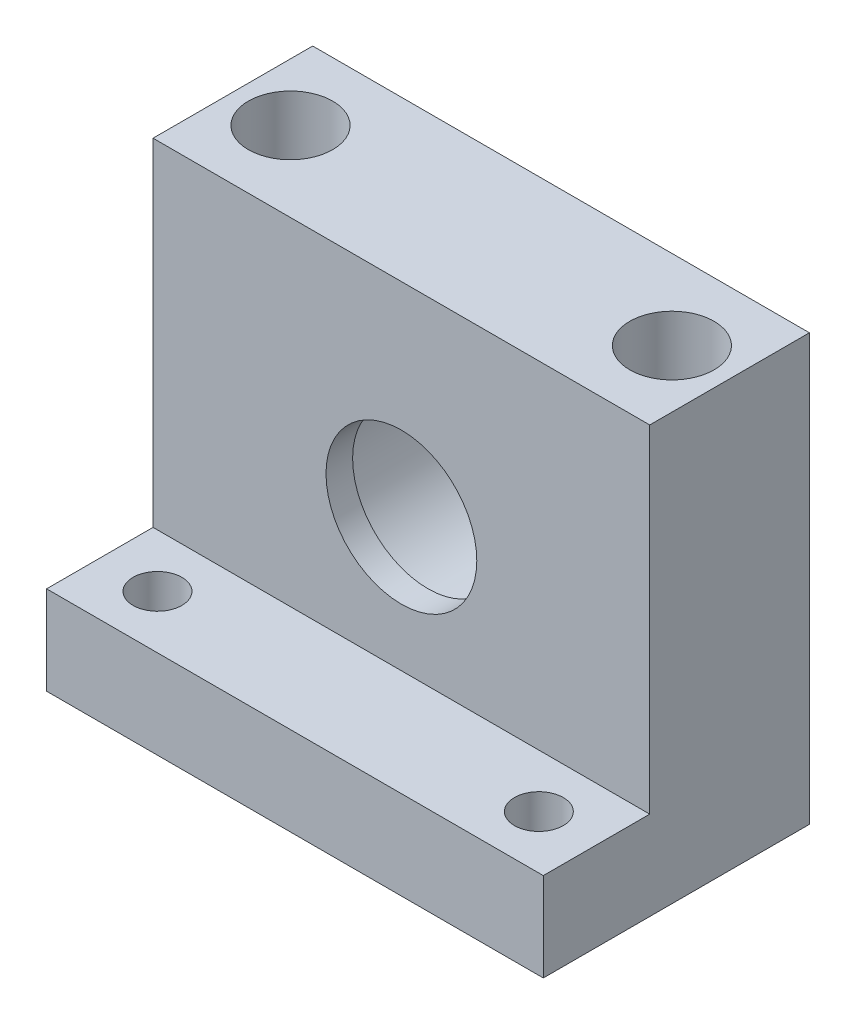
ISO-10303-21;
HEADER;
FILE_DESCRIPTION(('STEP AP214'),'2;1');
FILE_NAME('part.step','',(''),(''),'','','');
FILE_SCHEMA(('AUTOMOTIVE_DESIGN { 1 0 10303 214 1 1 1 1 }'));
ENDSEC;
DATA;
#1=APPLICATION_CONTEXT('core data for automotive mechanical design processes');
#2=APPLICATION_PROTOCOL_DEFINITION('international standard','automotive_design',2000,#1);
#3=PRODUCT_CONTEXT('',#1,'mechanical');
#4=PRODUCT('Part','Part','',(#3));
#5=PRODUCT_RELATED_PRODUCT_CATEGORY('part','',(#4));
#6=PRODUCT_DEFINITION_FORMATION('','',#4);
#7=PRODUCT_DEFINITION_CONTEXT('part definition',#1,'design');
#8=PRODUCT_DEFINITION('design','',#6,#7);
#9=PRODUCT_DEFINITION_SHAPE('','',#8);
#10=(LENGTH_UNIT() NAMED_UNIT(*) SI_UNIT(.MILLI.,.METRE.));
#11=(NAMED_UNIT(*) PLANE_ANGLE_UNIT() SI_UNIT($,.RADIAN.));
#12=(NAMED_UNIT(*) SI_UNIT($,.STERADIAN.) SOLID_ANGLE_UNIT());
#13=UNCERTAINTY_MEASURE_WITH_UNIT(LENGTH_MEASURE(1.E-05),#10,'distance_accuracy_value','');
#14=(GEOMETRIC_REPRESENTATION_CONTEXT(3) GLOBAL_UNCERTAINTY_ASSIGNED_CONTEXT((#13)) GLOBAL_UNIT_ASSIGNED_CONTEXT((#10,
#11,#12)) REPRESENTATION_CONTEXT('',''));
#15=CARTESIAN_POINT('',(0.,0.,0.));
#16=DIRECTION('',(0.,0.,1.));
#17=DIRECTION('',(1.,0.,0.));
#18=AXIS2_PLACEMENT_3D('',#15,#16,#17);
#19=CARTESIAN_POINT('',(28.,24.,18.));
#20=DIRECTION('',(-1.,0.,0.));
#21=DIRECTION('',(0.,-1.,0.));
#22=AXIS2_PLACEMENT_3D('',#19,#20,#21);
#23=PLANE('',#22);
#24=DIRECTION('',(0.,1.,0.));
#25=VECTOR('',#24,1.);
#26=CARTESIAN_POINT('',(28.,24.,0.));
#27=LINE('',#26,#25);
#28=CARTESIAN_POINT('',(28.,-24.,0.));
#29=VERTEX_POINT('',#28);
#30=CARTESIAN_POINT('',(28.,24.,0.));
#31=VERTEX_POINT('',#30);
#32=EDGE_CURVE('E99',#29,#31,#27,.T.);
#33=ORIENTED_EDGE('',*,*,#32,.T.);
#34=DIRECTION('',(0.,0.,-1.));
#35=VECTOR('',#34,1.);
#36=CARTESIAN_POINT('',(28.,24.,18.));
#37=LINE('',#36,#35);
#38=CARTESIAN_POINT('',(28.,24.,18.));
#39=VERTEX_POINT('',#38);
#40=EDGE_CURVE('E11',#39,#31,#37,.T.);
#41=ORIENTED_EDGE('',*,*,#40,.F.);
#42=DIRECTION('',(0.,1.,0.));
#43=VECTOR('',#42,1.);
#44=CARTESIAN_POINT('',(28.,24.,18.));
#45=LINE('',#44,#43);
#46=CARTESIAN_POINT('',(28.,-14.,18.));
#47=VERTEX_POINT('',#46);
#48=EDGE_CURVE('E92',#47,#39,#45,.T.);
#49=ORIENTED_EDGE('',*,*,#48,.F.);
#50=DIRECTION('',(0.,0.,-1.));
#51=VECTOR('',#50,1.);
#52=CARTESIAN_POINT('',(28.,-14.,30.));
#53=LINE('',#52,#51);
#54=CARTESIAN_POINT('',(28.,-14.,30.));
#55=VERTEX_POINT('',#54);
#56=EDGE_CURVE('E142',#55,#47,#53,.T.);
#57=ORIENTED_EDGE('',*,*,#56,.F.);
#58=DIRECTION('',(0.,1.,0.));
#59=VECTOR('',#58,1.);
#60=CARTESIAN_POINT('',(28.,-24.,30.));
#61=LINE('',#60,#59);
#62=CARTESIAN_POINT('',(28.,-24.,30.));
#63=VERTEX_POINT('',#62);
#64=EDGE_CURVE('E102',#63,#55,#61,.T.);
#65=ORIENTED_EDGE('',*,*,#64,.F.);
#66=DIRECTION('',(0.,0.,-1.));
#67=VECTOR('',#66,1.);
#68=CARTESIAN_POINT('',(28.,-24.,18.));
#69=LINE('',#68,#67);
#70=EDGE_CURVE('E85',#63,#29,#69,.T.);
#71=ORIENTED_EDGE('',*,*,#70,.T.);
#72=EDGE_LOOP('',(#33,#41,#49,#57,#65,#71));
#73=FACE_BOUND('',#72,.T.);
#74=ADVANCED_FACE('F38',(#73),#23,.F.);
#75=CARTESIAN_POINT('',(-28.,24.,18.));
#76=DIRECTION('',(0.,-1.,0.));
#77=DIRECTION('',(0.,0.,-1.));
#78=AXIS2_PLACEMENT_3D('',#75,#76,#77);
#79=PLANE('',#78);
#80=CARTESIAN_POINT('',(-21.5,24.,9.));
#81=DIRECTION('',(0.,1.,0.));
#82=DIRECTION('',(0.,0.,1.));
#83=AXIS2_PLACEMENT_3D('',#80,#81,#82);
#84=CIRCLE('',#83,4.75);
#85=CARTESIAN_POINT('',(-21.5,24.,13.75));
#86=VERTEX_POINT('',#85);
#87=EDGE_CURVE('E149',#86,#86,#84,.T.);
#88=ORIENTED_EDGE('',*,*,#87,.F.);
#89=EDGE_LOOP('',(#88));
#90=FACE_BOUND('',#89,.T.);
#91=CARTESIAN_POINT('',(21.5,24.,9.));
#92=DIRECTION('',(0.,1.,0.));
#93=DIRECTION('',(0.,0.,1.));
#94=AXIS2_PLACEMENT_3D('',#91,#92,#93);
#95=CIRCLE('',#94,4.75);
#96=CARTESIAN_POINT('',(21.5,24.,13.75));
#97=VERTEX_POINT('',#96);
#98=EDGE_CURVE('E169',#97,#97,#95,.T.);
#99=ORIENTED_EDGE('',*,*,#98,.F.);
#100=EDGE_LOOP('',(#99));
#101=FACE_BOUND('',#100,.T.);
#102=DIRECTION('',(-1.,0.,0.));
#103=VECTOR('',#102,1.);
#104=CARTESIAN_POINT('',(-28.,24.,0.));
#105=LINE('',#104,#103);
#106=CARTESIAN_POINT('',(-28.,24.,0.));
#107=VERTEX_POINT('',#106);
#108=EDGE_CURVE('E106',#31,#107,#105,.T.);
#109=ORIENTED_EDGE('',*,*,#108,.T.);
#110=DIRECTION('',(0.,0.,-1.));
#111=VECTOR('',#110,1.);
#112=CARTESIAN_POINT('',(-28.,24.,18.));
#113=LINE('',#112,#111);
#114=CARTESIAN_POINT('',(-28.,24.,18.));
#115=VERTEX_POINT('',#114);
#116=EDGE_CURVE('E46',#115,#107,#113,.T.);
#117=ORIENTED_EDGE('',*,*,#116,.F.);
#118=DIRECTION('',(-1.,0.,0.));
#119=VECTOR('',#118,1.);
#120=CARTESIAN_POINT('',(-28.,24.,18.));
#121=LINE('',#120,#119);
#122=EDGE_CURVE('E60',#39,#115,#121,.T.);
#123=ORIENTED_EDGE('',*,*,#122,.F.);
#124=ORIENTED_EDGE('',*,*,#40,.T.);
#125=EDGE_LOOP('',(#109,#117,#123,#124));
#126=FACE_BOUND('',#125,.T.);
#127=ADVANCED_FACE('F232',(#90,#101,#126),#79,.F.);
#128=CARTESIAN_POINT('',(-28.,24.,18.));
#129=DIRECTION('',(1.,0.,0.));
#130=DIRECTION('',(0.,1.,0.));
#131=AXIS2_PLACEMENT_3D('',#128,#129,#130);
#132=PLANE('',#131);
#133=DIRECTION('',(0.,-1.,0.));
#134=VECTOR('',#133,1.);
#135=CARTESIAN_POINT('',(-28.,24.,0.));
#136=LINE('',#135,#134);
#137=CARTESIAN_POINT('',(-28.,-24.,0.));
#138=VERTEX_POINT('',#137);
#139=EDGE_CURVE('E93',#107,#138,#136,.T.);
#140=ORIENTED_EDGE('',*,*,#139,.T.);
#141=DIRECTION('',(0.,0.,-1.));
#142=VECTOR('',#141,1.);
#143=CARTESIAN_POINT('',(-28.,-24.,18.));
#144=LINE('',#143,#142);
#145=CARTESIAN_POINT('',(-28.,-24.,30.));
#146=VERTEX_POINT('',#145);
#147=EDGE_CURVE('E88',#146,#138,#144,.T.);
#148=ORIENTED_EDGE('',*,*,#147,.F.);
#149=DIRECTION('',(0.,-1.,0.));
#150=VECTOR('',#149,1.);
#151=CARTESIAN_POINT('',(-28.,-24.,30.));
#152=LINE('',#151,#150);
#153=CARTESIAN_POINT('',(-28.,-14.,30.));
#154=VERTEX_POINT('',#153);
#155=EDGE_CURVE('E143',#154,#146,#152,.T.);
#156=ORIENTED_EDGE('',*,*,#155,.F.);
#157=DIRECTION('',(0.,0.,-1.));
#158=VECTOR('',#157,1.);
#159=CARTESIAN_POINT('',(-28.,-14.,30.));
#160=LINE('',#159,#158);
#161=CARTESIAN_POINT('',(-28.,-14.,18.));
#162=VERTEX_POINT('',#161);
#163=EDGE_CURVE('E140',#154,#162,#160,.T.);
#164=ORIENTED_EDGE('',*,*,#163,.T.);
#165=DIRECTION('',(0.,-1.,0.));
#166=VECTOR('',#165,1.);
#167=CARTESIAN_POINT('',(-28.,24.,18.));
#168=LINE('',#167,#166);
#169=EDGE_CURVE('E103',#115,#162,#168,.T.);
#170=ORIENTED_EDGE('',*,*,#169,.F.);
#171=ORIENTED_EDGE('',*,*,#116,.T.);
#172=EDGE_LOOP('',(#140,#148,#156,#164,#170,#171));
#173=FACE_BOUND('',#172,.T.);
#174=ADVANCED_FACE('F145',(#173),#132,.F.);
#175=CARTESIAN_POINT('',(-28.,-24.,18.));
#176=DIRECTION('',(0.,1.,0.));
#177=DIRECTION('',(0.,0.,1.));
#178=AXIS2_PLACEMENT_3D('',#175,#176,#177);
#179=PLANE('',#178);
#180=CARTESIAN_POINT('',(-21.5,-24.,24.));
#181=DIRECTION('',(0.,1.,0.));
#182=DIRECTION('',(0.,0.,1.));
#183=AXIS2_PLACEMENT_3D('',#180,#181,#182);
#184=CIRCLE('',#183,2.74999999999999);
#185=CARTESIAN_POINT('',(-21.5,-24.,26.75));
#186=VERTEX_POINT('',#185);
#187=EDGE_CURVE('E250',#186,#186,#184,.T.);
#188=ORIENTED_EDGE('',*,*,#187,.T.);
#189=EDGE_LOOP('',(#188));
#190=FACE_BOUND('',#189,.T.);
#191=CARTESIAN_POINT('',(21.5,-24.,24.));
#192=DIRECTION('',(0.,1.,0.));
#193=DIRECTION('',(0.,0.,1.));
#194=AXIS2_PLACEMENT_3D('',#191,#192,#193);
#195=CIRCLE('',#194,2.74999999999999);
#196=CARTESIAN_POINT('',(21.5,-24.,26.75));
#197=VERTEX_POINT('',#196);
#198=EDGE_CURVE('E144',#197,#197,#195,.T.);
#199=ORIENTED_EDGE('',*,*,#198,.T.);
#200=EDGE_LOOP('',(#199));
#201=FACE_BOUND('',#200,.T.);
#202=CARTESIAN_POINT('',(-21.5,-24.,9.));
#203=DIRECTION('',(0.,1.,0.));
#204=DIRECTION('',(0.,0.,1.));
#205=AXIS2_PLACEMENT_3D('',#202,#203,#204);
#206=CIRCLE('',#205,2.74999999999999);
#207=CARTESIAN_POINT('',(-21.5,-24.,11.75));
#208=VERTEX_POINT('',#207);
#209=EDGE_CURVE('E166',#208,#208,#206,.T.);
#210=ORIENTED_EDGE('',*,*,#209,.T.);
#211=EDGE_LOOP('',(#210));
#212=FACE_BOUND('',#211,.T.);
#213=CARTESIAN_POINT('',(21.5,-24.,9.));
#214=DIRECTION('',(0.,1.,0.));
#215=DIRECTION('',(0.,0.,1.));
#216=AXIS2_PLACEMENT_3D('',#213,#214,#215);
#217=CIRCLE('',#216,2.74999999999999);
#218=CARTESIAN_POINT('',(21.5,-24.,11.75));
#219=VERTEX_POINT('',#218);
#220=EDGE_CURVE('E178',#219,#219,#217,.T.);
#221=ORIENTED_EDGE('',*,*,#220,.T.);
#222=EDGE_LOOP('',(#221));
#223=FACE_BOUND('',#222,.T.);
#224=DIRECTION('',(1.,0.,0.));
#225=VECTOR('',#224,1.);
#226=CARTESIAN_POINT('',(-28.,-24.,0.));
#227=LINE('',#226,#225);
#228=EDGE_CURVE('E80',#138,#29,#227,.T.);
#229=ORIENTED_EDGE('',*,*,#228,.T.);
#230=ORIENTED_EDGE('',*,*,#70,.F.);
#231=DIRECTION('',(1.,0.,0.));
#232=VECTOR('',#231,1.);
#233=CARTESIAN_POINT('',(-28.,-24.,30.));
#234=LINE('',#233,#232);
#235=EDGE_CURVE('E279',#146,#63,#234,.T.);
#236=ORIENTED_EDGE('',*,*,#235,.F.);
#237=ORIENTED_EDGE('',*,*,#147,.T.);
#238=EDGE_LOOP('',(#229,#230,#236,#237));
#239=FACE_BOUND('',#238,.T.);
#240=ADVANCED_FACE('F82',(#190,#201,#212,#223,#239),#179,.F.);
#241=CARTESIAN_POINT('',(0.,0.,18.));
#242=DIRECTION('',(0.,0.,1.));
#243=DIRECTION('',(1.,0.,0.));
#244=AXIS2_PLACEMENT_3D('',#241,#242,#243);
#245=PLANE('',#244);
#246=DIRECTION('',(-1.,0.,0.));
#247=VECTOR('',#246,1.);
#248=CARTESIAN_POINT('',(-28.,-14.,18.));
#249=LINE('',#248,#247);
#250=EDGE_CURVE('E54',#47,#162,#249,.T.);
#251=ORIENTED_EDGE('',*,*,#250,.F.);
#252=ORIENTED_EDGE('',*,*,#48,.T.);
#253=ORIENTED_EDGE('',*,*,#122,.T.);
#254=ORIENTED_EDGE('',*,*,#169,.T.);
#255=EDGE_LOOP('',(#251,#252,#253,#254));
#256=FACE_BOUND('',#255,.T.);
#257=CARTESIAN_POINT('',(0.,1.,18.));
#258=DIRECTION('',(0.,0.,1.));
#259=DIRECTION('',(1.,0.,0.));
#260=AXIS2_PLACEMENT_3D('',#257,#258,#259);
#261=CIRCLE('',#260,8.5);
#262=CARTESIAN_POINT('',(8.5,1.,18.));
#263=VERTEX_POINT('',#262);
#264=EDGE_CURVE('E208',#263,#263,#261,.T.);
#265=ORIENTED_EDGE('',*,*,#264,.F.);
#266=EDGE_LOOP('',(#265));
#267=FACE_BOUND('',#266,.T.);
#268=ADVANCED_FACE('F128',(#256,#267),#245,.T.);
#269=CARTESIAN_POINT('',(0.,0.,0.));
#270=DIRECTION('',(0.,0.,1.));
#271=DIRECTION('',(1.,0.,0.));
#272=AXIS2_PLACEMENT_3D('',#269,#270,#271);
#273=PLANE('',#272);
#274=CARTESIAN_POINT('',(-12.5,19.,0.));
#275=DIRECTION('',(0.,0.,-1.));
#276=DIRECTION('',(-1.,0.,0.));
#277=AXIS2_PLACEMENT_3D('',#274,#275,#276);
#278=CIRCLE('',#277,3.);
#279=CARTESIAN_POINT('',(-15.5,19.,0.));
#280=VERTEX_POINT('',#279);
#281=EDGE_CURVE('E574',#280,#280,#278,.T.);
#282=ORIENTED_EDGE('',*,*,#281,.F.);
#283=EDGE_LOOP('',(#282));
#284=FACE_BOUND('',#283,.T.);
#285=CARTESIAN_POINT('',(12.5,19.,0.));
#286=DIRECTION('',(0.,0.,-1.));
#287=DIRECTION('',(-1.,0.,0.));
#288=AXIS2_PLACEMENT_3D('',#285,#286,#287);
#289=CIRCLE('',#288,3.);
#290=CARTESIAN_POINT('',(9.5,19.,0.));
#291=VERTEX_POINT('',#290);
#292=EDGE_CURVE('E573',#291,#291,#289,.T.);
#293=ORIENTED_EDGE('',*,*,#292,.F.);
#294=EDGE_LOOP('',(#293));
#295=FACE_BOUND('',#294,.T.);
#296=CARTESIAN_POINT('',(-12.,8.00000000000001,0.));
#297=DIRECTION('',(0.,0.,-1.));
#298=DIRECTION('',(-1.,0.,0.));
#299=AXIS2_PLACEMENT_3D('',#296,#297,#298);
#300=CIRCLE('',#299,1.25);
#301=CARTESIAN_POINT('',(-13.25,8.00000000000001,0.));
#302=VERTEX_POINT('',#301);
#303=EDGE_CURVE('E181',#302,#302,#300,.T.);
#304=ORIENTED_EDGE('',*,*,#303,.F.);
#305=EDGE_LOOP('',(#304));
#306=FACE_BOUND('',#305,.T.);
#307=CARTESIAN_POINT('',(12.,8.00000000000001,0.));
#308=DIRECTION('',(0.,0.,-1.));
#309=DIRECTION('',(-1.,0.,0.));
#310=AXIS2_PLACEMENT_3D('',#307,#308,#309);
#311=CIRCLE('',#310,1.25);
#312=CARTESIAN_POINT('',(10.75,8.00000000000001,0.));
#313=VERTEX_POINT('',#312);
#314=EDGE_CURVE('E187',#313,#313,#311,.T.);
#315=ORIENTED_EDGE('',*,*,#314,.F.);
#316=EDGE_LOOP('',(#315));
#317=FACE_BOUND('',#316,.T.);
#318=CARTESIAN_POINT('',(-12.,-6.,0.));
#319=DIRECTION('',(0.,0.,-1.));
#320=DIRECTION('',(-1.,0.,0.));
#321=AXIS2_PLACEMENT_3D('',#318,#319,#320);
#322=CIRCLE('',#321,1.25);
#323=CARTESIAN_POINT('',(-13.25,-6.,0.));
#324=VERTEX_POINT('',#323);
#325=EDGE_CURVE('E193',#324,#324,#322,.T.);
#326=ORIENTED_EDGE('',*,*,#325,.F.);
#327=EDGE_LOOP('',(#326));
#328=FACE_BOUND('',#327,.T.);
#329=CARTESIAN_POINT('',(12.,-6.,0.));
#330=DIRECTION('',(0.,0.,-1.));
#331=DIRECTION('',(-1.,0.,0.));
#332=AXIS2_PLACEMENT_3D('',#329,#330,#331);
#333=CIRCLE('',#332,1.25);
#334=CARTESIAN_POINT('',(10.75,-6.,0.));
#335=VERTEX_POINT('',#334);
#336=EDGE_CURVE('E199',#335,#335,#333,.T.);
#337=ORIENTED_EDGE('',*,*,#336,.F.);
#338=EDGE_LOOP('',(#337));
#339=FACE_BOUND('',#338,.T.);
#340=CARTESIAN_POINT('',(0.,1.,0.));
#341=DIRECTION('',(0.,0.,-1.));
#342=DIRECTION('',(-1.,0.,0.));
#343=AXIS2_PLACEMENT_3D('',#340,#341,#342);
#344=CIRCLE('',#343,11.);
#345=CARTESIAN_POINT('',(-11.,1.,0.));
#346=VERTEX_POINT('',#345);
#347=EDGE_CURVE('E111',#346,#346,#344,.T.);
#348=ORIENTED_EDGE('',*,*,#347,.F.);
#349=EDGE_LOOP('',(#348));
#350=FACE_BOUND('',#349,.T.);
#351=ORIENTED_EDGE('',*,*,#32,.F.);
#352=ORIENTED_EDGE('',*,*,#228,.F.);
#353=ORIENTED_EDGE('',*,*,#139,.F.);
#354=ORIENTED_EDGE('',*,*,#108,.F.);
#355=EDGE_LOOP('',(#351,#352,#353,#354));
#356=FACE_BOUND('',#355,.T.);
#357=ADVANCED_FACE('F105',(#284,#295,#306,#317,#328,#339,#350,#356),#273,.F.);
#358=CARTESIAN_POINT('',(0.,1.,15.));
#359=DIRECTION('',(0.,0.,-1.));
#360=DIRECTION('',(-1.,0.,0.));
#361=AXIS2_PLACEMENT_3D('',#358,#359,#360);
#362=CYLINDRICAL_SURFACE('',#361,11.);
#363=CARTESIAN_POINT('',(0.,1.,15.));
#364=DIRECTION('',(0.,0.,-1.));
#365=DIRECTION('',(-1.,0.,0.));
#366=AXIS2_PLACEMENT_3D('',#363,#364,#365);
#367=CIRCLE('',#366,11.);
#368=CARTESIAN_POINT('',(-11.,1.,15.));
#369=VERTEX_POINT('',#368);
#370=EDGE_CURVE('E107',#369,#369,#367,.T.);
#371=ORIENTED_EDGE('',*,*,#370,.F.);
#372=EDGE_LOOP('',(#371));
#373=FACE_BOUND('',#372,.T.);
#374=ORIENTED_EDGE('',*,*,#347,.T.);
#375=EDGE_LOOP('',(#374));
#376=FACE_BOUND('',#375,.T.);
#377=ADVANCED_FACE('F215',(#373,#376),#362,.F.);
#378=CARTESIAN_POINT('',(0.,1.,15.));
#379=DIRECTION('',(0.,0.,-1.));
#380=DIRECTION('',(-1.,0.,0.));
#381=AXIS2_PLACEMENT_3D('',#378,#379,#380);
#382=PLANE('',#381);
#383=CARTESIAN_POINT('',(0.,1.,15.));
#384=DIRECTION('',(0.,0.,-1.));
#385=DIRECTION('',(-1.,0.,0.));
#386=AXIS2_PLACEMENT_3D('',#383,#384,#385);
#387=CIRCLE('',#386,8.5);
#388=CARTESIAN_POINT('',(-8.5,1.,15.));
#389=VERTEX_POINT('',#388);
#390=EDGE_CURVE('E205',#389,#389,#387,.T.);
#391=ORIENTED_EDGE('',*,*,#390,.F.);
#392=EDGE_LOOP('',(#391));
#393=FACE_BOUND('',#392,.T.);
#394=ORIENTED_EDGE('',*,*,#370,.T.);
#395=EDGE_LOOP('',(#394));
#396=FACE_BOUND('',#395,.T.);
#397=ADVANCED_FACE('F224',(#393,#396),#382,.T.);
#398=CARTESIAN_POINT('',(0.,1.,32.));
#399=DIRECTION('',(0.,0.,-1.));
#400=DIRECTION('',(-1.,0.,0.));
#401=AXIS2_PLACEMENT_3D('',#398,#399,#400);
#402=CYLINDRICAL_SURFACE('',#401,8.5);
#403=ORIENTED_EDGE('',*,*,#264,.T.);
#404=EDGE_LOOP('',(#403));
#405=FACE_BOUND('',#404,.T.);
#406=ORIENTED_EDGE('',*,*,#390,.T.);
#407=EDGE_LOOP('',(#406));
#408=FACE_BOUND('',#407,.T.);
#409=ADVANCED_FACE('F305',(#405,#408),#402,.F.);
#410=CARTESIAN_POINT('',(12.,-6.,8.5));
#411=DIRECTION('',(0.,0.,-1.));
#412=DIRECTION('',(-1.,0.,0.));
#413=AXIS2_PLACEMENT_3D('',#410,#411,#412);
#414=CONICAL_SURFACE('',#413,1.25,1.02974425867665);
#415=CARTESIAN_POINT('',(12.,-6.,9.25107577378445));
#416=VERTEX_POINT('',#415);
#417=VERTEX_LOOP('',#416);
#418=FACE_BOUND('',#417,.T.);
#419=CARTESIAN_POINT('',(12.,-6.,8.5));
#420=DIRECTION('',(0.,0.,-1.));
#421=DIRECTION('',(-1.,0.,0.));
#422=AXIS2_PLACEMENT_3D('',#419,#420,#421);
#423=CIRCLE('',#422,1.25);
#424=CARTESIAN_POINT('',(10.75,-6.,8.5));
#425=VERTEX_POINT('',#424);
#426=EDGE_CURVE('E202',#425,#425,#423,.T.);
#427=ORIENTED_EDGE('',*,*,#426,.T.);
#428=EDGE_LOOP('',(#427));
#429=FACE_BOUND('',#428,.T.);
#430=ADVANCED_FACE('F301',(#418,#429),#414,.F.);
#431=CARTESIAN_POINT('',(12.,-6.,0.));
#432=DIRECTION('',(0.,0.,-1.));
#433=DIRECTION('',(-1.,0.,0.));
#434=AXIS2_PLACEMENT_3D('',#431,#432,#433);
#435=CYLINDRICAL_SURFACE('',#434,1.25);
#436=ORIENTED_EDGE('',*,*,#426,.F.);
#437=EDGE_LOOP('',(#436));
#438=FACE_BOUND('',#437,.T.);
#439=ORIENTED_EDGE('',*,*,#336,.T.);
#440=EDGE_LOOP('',(#439));
#441=FACE_BOUND('',#440,.T.);
#442=ADVANCED_FACE('F304',(#438,#441),#435,.F.);
#443=CARTESIAN_POINT('',(-12.,-6.,8.5));
#444=DIRECTION('',(0.,0.,-1.));
#445=DIRECTION('',(-1.,0.,0.));
#446=AXIS2_PLACEMENT_3D('',#443,#444,#445);
#447=CONICAL_SURFACE('',#446,1.25,1.02974425867665);
#448=CARTESIAN_POINT('',(-12.,-6.,9.25107577378445));
#449=VERTEX_POINT('',#448);
#450=VERTEX_LOOP('',#449);
#451=FACE_BOUND('',#450,.T.);
#452=CARTESIAN_POINT('',(-12.,-6.,8.5));
#453=DIRECTION('',(0.,0.,-1.));
#454=DIRECTION('',(-1.,0.,0.));
#455=AXIS2_PLACEMENT_3D('',#452,#453,#454);
#456=CIRCLE('',#455,1.25);
#457=CARTESIAN_POINT('',(-13.25,-6.,8.5));
#458=VERTEX_POINT('',#457);
#459=EDGE_CURVE('E196',#458,#458,#456,.T.);
#460=ORIENTED_EDGE('',*,*,#459,.T.);
#461=EDGE_LOOP('',(#460));
#462=FACE_BOUND('',#461,.T.);
#463=ADVANCED_FACE('F311',(#451,#462),#447,.F.);
#464=CARTESIAN_POINT('',(-12.,-6.,0.));
#465=DIRECTION('',(0.,0.,-1.));
#466=DIRECTION('',(-1.,0.,0.));
#467=AXIS2_PLACEMENT_3D('',#464,#465,#466);
#468=CYLINDRICAL_SURFACE('',#467,1.25);
#469=ORIENTED_EDGE('',*,*,#459,.F.);
#470=EDGE_LOOP('',(#469));
#471=FACE_BOUND('',#470,.T.);
#472=ORIENTED_EDGE('',*,*,#325,.T.);
#473=EDGE_LOOP('',(#472));
#474=FACE_BOUND('',#473,.T.);
#475=ADVANCED_FACE('F318',(#471,#474),#468,.F.);
#476=CARTESIAN_POINT('',(12.,8.00000000000001,8.5));
#477=DIRECTION('',(0.,0.,-1.));
#478=DIRECTION('',(-1.,0.,0.));
#479=AXIS2_PLACEMENT_3D('',#476,#477,#478);
#480=CONICAL_SURFACE('',#479,1.25,1.02974425867665);
#481=CARTESIAN_POINT('',(12.,8.00000000000001,9.25107577378445));
#482=VERTEX_POINT('',#481);
#483=VERTEX_LOOP('',#482);
#484=FACE_BOUND('',#483,.T.);
#485=CARTESIAN_POINT('',(12.,8.00000000000001,8.5));
#486=DIRECTION('',(0.,0.,-1.));
#487=DIRECTION('',(-1.,0.,0.));
#488=AXIS2_PLACEMENT_3D('',#485,#486,#487);
#489=CIRCLE('',#488,1.25);
#490=CARTESIAN_POINT('',(10.75,8.00000000000001,8.5));
#491=VERTEX_POINT('',#490);
#492=EDGE_CURVE('E190',#491,#491,#489,.T.);
#493=ORIENTED_EDGE('',*,*,#492,.T.);
#494=EDGE_LOOP('',(#493));
#495=FACE_BOUND('',#494,.T.);
#496=ADVANCED_FACE('F367',(#484,#495),#480,.F.);
#497=CARTESIAN_POINT('',(12.,8.00000000000001,0.));
#498=DIRECTION('',(0.,0.,-1.));
#499=DIRECTION('',(-1.,0.,0.));
#500=AXIS2_PLACEMENT_3D('',#497,#498,#499);
#501=CYLINDRICAL_SURFACE('',#500,1.25);
#502=ORIENTED_EDGE('',*,*,#492,.F.);
#503=EDGE_LOOP('',(#502));
#504=FACE_BOUND('',#503,.T.);
#505=ORIENTED_EDGE('',*,*,#314,.T.);
#506=EDGE_LOOP('',(#505));
#507=FACE_BOUND('',#506,.T.);
#508=ADVANCED_FACE('F378',(#504,#507),#501,.F.);
#509=CARTESIAN_POINT('',(-12.,8.00000000000001,8.5));
#510=DIRECTION('',(0.,0.,-1.));
#511=DIRECTION('',(-1.,0.,0.));
#512=AXIS2_PLACEMENT_3D('',#509,#510,#511);
#513=CONICAL_SURFACE('',#512,1.25,1.02974425867665);
#514=CARTESIAN_POINT('',(-12.,8.00000000000001,9.25107577378445));
#515=VERTEX_POINT('',#514);
#516=VERTEX_LOOP('',#515);
#517=FACE_BOUND('',#516,.T.);
#518=CARTESIAN_POINT('',(-12.,8.00000000000001,8.5));
#519=DIRECTION('',(0.,0.,-1.));
#520=DIRECTION('',(-1.,0.,0.));
#521=AXIS2_PLACEMENT_3D('',#518,#519,#520);
#522=CIRCLE('',#521,1.25);
#523=CARTESIAN_POINT('',(-13.25,8.00000000000001,8.5));
#524=VERTEX_POINT('',#523);
#525=EDGE_CURVE('E184',#524,#524,#522,.T.);
#526=ORIENTED_EDGE('',*,*,#525,.T.);
#527=EDGE_LOOP('',(#526));
#528=FACE_BOUND('',#527,.T.);
#529=ADVANCED_FACE('F388',(#517,#528),#513,.F.);
#530=CARTESIAN_POINT('',(-12.,8.00000000000001,0.));
#531=DIRECTION('',(0.,0.,-1.));
#532=DIRECTION('',(-1.,0.,0.));
#533=AXIS2_PLACEMENT_3D('',#530,#531,#532);
#534=CYLINDRICAL_SURFACE('',#533,1.25);
#535=ORIENTED_EDGE('',*,*,#525,.F.);
#536=EDGE_LOOP('',(#535));
#537=FACE_BOUND('',#536,.T.);
#538=ORIENTED_EDGE('',*,*,#303,.T.);
#539=EDGE_LOOP('',(#538));
#540=FACE_BOUND('',#539,.T.);
#541=ADVANCED_FACE('F262',(#537,#540),#534,.F.);
#542=CARTESIAN_POINT('',(21.5,24.,9.));
#543=DIRECTION('',(0.,1.,0.));
#544=DIRECTION('',(0.,0.,1.));
#545=AXIS2_PLACEMENT_3D('',#542,#543,#544);
#546=CYLINDRICAL_SURFACE('',#545,2.74999999999999);
#547=ORIENTED_EDGE('',*,*,#220,.F.);
#548=EDGE_LOOP('',(#547));
#549=FACE_BOUND('',#548,.T.);
#550=CARTESIAN_POINT('',(21.5,-5.99999999999999,9.));
#551=DIRECTION('',(0.,1.,0.));
#552=DIRECTION('',(0.,0.,1.));
#553=AXIS2_PLACEMENT_3D('',#550,#551,#552);
#554=CIRCLE('',#553,2.75);
#555=CARTESIAN_POINT('',(21.5,-5.99999999999999,11.75));
#556=VERTEX_POINT('',#555);
#557=EDGE_CURVE('E175',#556,#556,#554,.T.);
#558=ORIENTED_EDGE('',*,*,#557,.T.);
#559=EDGE_LOOP('',(#558));
#560=FACE_BOUND('',#559,.T.);
#561=ADVANCED_FACE('F258',(#549,#560),#546,.F.);
#562=CARTESIAN_POINT('',(24.25,-5.99999999999999,9.));
#563=DIRECTION('',(0.,-1.,0.));
#564=DIRECTION('',(0.,0.,-1.));
#565=AXIS2_PLACEMENT_3D('',#562,#563,#564);
#566=PLANE('',#565);
#567=ORIENTED_EDGE('',*,*,#557,.F.);
#568=EDGE_LOOP('',(#567));
#569=FACE_BOUND('',#568,.T.);
#570=CARTESIAN_POINT('',(21.5,-5.99999999999999,9.));
#571=DIRECTION('',(0.,1.,0.));
#572=DIRECTION('',(0.,0.,1.));
#573=AXIS2_PLACEMENT_3D('',#570,#571,#572);
#574=CIRCLE('',#573,4.74999999999999);
#575=CARTESIAN_POINT('',(21.5,-5.99999999999999,13.75));
#576=VERTEX_POINT('',#575);
#577=EDGE_CURVE('E172',#576,#576,#574,.T.);
#578=ORIENTED_EDGE('',*,*,#577,.T.);
#579=EDGE_LOOP('',(#578));
#580=FACE_BOUND('',#579,.T.);
#581=ADVANCED_FACE('F261',(#569,#580),#566,.F.);
#582=CARTESIAN_POINT('',(21.5,24.,9.));
#583=DIRECTION('',(0.,1.,0.));
#584=DIRECTION('',(0.,0.,1.));
#585=AXIS2_PLACEMENT_3D('',#582,#583,#584);
#586=CYLINDRICAL_SURFACE('',#585,4.75);
#587=ORIENTED_EDGE('',*,*,#577,.F.);
#588=EDGE_LOOP('',(#587));
#589=FACE_BOUND('',#588,.T.);
#590=ORIENTED_EDGE('',*,*,#98,.T.);
#591=EDGE_LOOP('',(#590));
#592=FACE_BOUND('',#591,.T.);
#593=ADVANCED_FACE('F268',(#589,#592),#586,.F.);
#594=CARTESIAN_POINT('',(-21.5,24.,9.));
#595=DIRECTION('',(0.,1.,0.));
#596=DIRECTION('',(0.,0.,1.));
#597=AXIS2_PLACEMENT_3D('',#594,#595,#596);
#598=CYLINDRICAL_SURFACE('',#597,2.74999999999999);
#599=ORIENTED_EDGE('',*,*,#209,.F.);
#600=EDGE_LOOP('',(#599));
#601=FACE_BOUND('',#600,.T.);
#602=CARTESIAN_POINT('',(-21.5,-5.99999999999999,9.));
#603=DIRECTION('',(0.,1.,0.));
#604=DIRECTION('',(0.,0.,1.));
#605=AXIS2_PLACEMENT_3D('',#602,#603,#604);
#606=CIRCLE('',#605,2.75);
#607=CARTESIAN_POINT('',(-21.5,-5.99999999999999,11.75));
#608=VERTEX_POINT('',#607);
#609=EDGE_CURVE('E163',#608,#608,#606,.T.);
#610=ORIENTED_EDGE('',*,*,#609,.T.);
#611=EDGE_LOOP('',(#610));
#612=FACE_BOUND('',#611,.T.);
#613=ADVANCED_FACE('F274',(#601,#612),#598,.F.);
#614=CARTESIAN_POINT('',(-18.75,-5.99999999999999,9.));
#615=DIRECTION('',(0.,-1.,0.));
#616=DIRECTION('',(0.,0.,-1.));
#617=AXIS2_PLACEMENT_3D('',#614,#615,#616);
#618=PLANE('',#617);
#619=ORIENTED_EDGE('',*,*,#609,.F.);
#620=EDGE_LOOP('',(#619));
#621=FACE_BOUND('',#620,.T.);
#622=CARTESIAN_POINT('',(-21.5,-5.99999999999999,9.));
#623=DIRECTION('',(0.,1.,0.));
#624=DIRECTION('',(0.,0.,1.));
#625=AXIS2_PLACEMENT_3D('',#622,#623,#624);
#626=CIRCLE('',#625,4.74999999999999);
#627=CARTESIAN_POINT('',(-21.5,-5.99999999999999,13.75));
#628=VERTEX_POINT('',#627);
#629=EDGE_CURVE('E160',#628,#628,#626,.T.);
#630=ORIENTED_EDGE('',*,*,#629,.T.);
#631=EDGE_LOOP('',(#630));
#632=FACE_BOUND('',#631,.T.);
#633=ADVANCED_FACE('F443',(#621,#632),#618,.F.);
#634=CARTESIAN_POINT('',(-21.5,24.,9.));
#635=DIRECTION('',(0.,1.,0.));
#636=DIRECTION('',(0.,0.,1.));
#637=AXIS2_PLACEMENT_3D('',#634,#635,#636);
#638=CYLINDRICAL_SURFACE('',#637,4.75);
#639=ORIENTED_EDGE('',*,*,#629,.F.);
#640=EDGE_LOOP('',(#639));
#641=FACE_BOUND('',#640,.T.);
#642=ORIENTED_EDGE('',*,*,#87,.T.);
#643=EDGE_LOOP('',(#642));
#644=FACE_BOUND('',#643,.T.);
#645=ADVANCED_FACE('F453',(#641,#644),#638,.F.);
#646=CARTESIAN_POINT('',(-28.,-14.,30.));
#647=DIRECTION('',(0.,-1.,0.));
#648=DIRECTION('',(0.,0.,-1.));
#649=AXIS2_PLACEMENT_3D('',#646,#647,#648);
#650=PLANE('',#649);
#651=CARTESIAN_POINT('',(-21.5,-14.,24.));
#652=DIRECTION('',(0.,1.,0.));
#653=DIRECTION('',(0.,0.,1.));
#654=AXIS2_PLACEMENT_3D('',#651,#652,#653);
#655=CIRCLE('',#654,2.74999999999999);
#656=CARTESIAN_POINT('',(-21.5,-14.,26.75));
#657=VERTEX_POINT('',#656);
#658=EDGE_CURVE('E583',#657,#657,#655,.T.);
#659=ORIENTED_EDGE('',*,*,#658,.F.);
#660=EDGE_LOOP('',(#659));
#661=FACE_BOUND('',#660,.T.);
#662=CARTESIAN_POINT('',(21.5,-14.,24.));
#663=DIRECTION('',(0.,1.,0.));
#664=DIRECTION('',(0.,0.,1.));
#665=AXIS2_PLACEMENT_3D('',#662,#663,#664);
#666=CIRCLE('',#665,2.74999999999999);
#667=CARTESIAN_POINT('',(21.5,-14.,26.75));
#668=VERTEX_POINT('',#667);
#669=EDGE_CURVE('E587',#668,#668,#666,.T.);
#670=ORIENTED_EDGE('',*,*,#669,.F.);
#671=EDGE_LOOP('',(#670));
#672=FACE_BOUND('',#671,.T.);
#673=ORIENTED_EDGE('',*,*,#250,.T.);
#674=ORIENTED_EDGE('',*,*,#163,.F.);
#675=DIRECTION('',(-1.,0.,0.));
#676=VECTOR('',#675,1.);
#677=CARTESIAN_POINT('',(-28.,-14.,30.));
#678=LINE('',#677,#676);
#679=EDGE_CURVE('E147',#55,#154,#678,.T.);
#680=ORIENTED_EDGE('',*,*,#679,.F.);
#681=ORIENTED_EDGE('',*,*,#56,.T.);
#682=EDGE_LOOP('',(#673,#674,#680,#681));
#683=FACE_BOUND('',#682,.T.);
#684=ADVANCED_FACE('F137',(#661,#672,#683),#650,.F.);
#685=CARTESIAN_POINT('',(0.,0.,30.));
#686=DIRECTION('',(0.,0.,-1.));
#687=DIRECTION('',(-1.,0.,0.));
#688=AXIS2_PLACEMENT_3D('',#685,#686,#687);
#689=PLANE('',#688);
#690=ORIENTED_EDGE('',*,*,#155,.T.);
#691=ORIENTED_EDGE('',*,*,#235,.T.);
#692=ORIENTED_EDGE('',*,*,#64,.T.);
#693=ORIENTED_EDGE('',*,*,#679,.T.);
#694=EDGE_LOOP('',(#690,#691,#692,#693));
#695=FACE_BOUND('',#694,.T.);
#696=ADVANCED_FACE('F282',(#695),#689,.F.);
#697=CARTESIAN_POINT('',(21.5,-14.,24.));
#698=DIRECTION('',(0.,1.,0.));
#699=DIRECTION('',(0.,0.,1.));
#700=AXIS2_PLACEMENT_3D('',#697,#698,#699);
#701=CYLINDRICAL_SURFACE('',#700,2.74999999999999);
#702=ORIENTED_EDGE('',*,*,#198,.F.);
#703=EDGE_LOOP('',(#702));
#704=FACE_BOUND('',#703,.T.);
#705=ORIENTED_EDGE('',*,*,#669,.T.);
#706=EDGE_LOOP('',(#705));
#707=FACE_BOUND('',#706,.T.);
#708=ADVANCED_FACE('F491',(#704,#707),#701,.F.);
#709=CARTESIAN_POINT('',(-21.5,-14.,24.));
#710=DIRECTION('',(0.,1.,0.));
#711=DIRECTION('',(0.,0.,1.));
#712=AXIS2_PLACEMENT_3D('',#709,#710,#711);
#713=CYLINDRICAL_SURFACE('',#712,2.74999999999999);
#714=ORIENTED_EDGE('',*,*,#187,.F.);
#715=EDGE_LOOP('',(#714));
#716=FACE_BOUND('',#715,.T.);
#717=ORIENTED_EDGE('',*,*,#658,.T.);
#718=EDGE_LOOP('',(#717));
#719=FACE_BOUND('',#718,.T.);
#720=ADVANCED_FACE('F512',(#716,#719),#713,.F.);
#721=CARTESIAN_POINT('',(12.5,19.,8.));
#722=DIRECTION('',(0.,0.,-1.));
#723=DIRECTION('',(-1.,0.,0.));
#724=AXIS2_PLACEMENT_3D('',#721,#722,#723);
#725=CYLINDRICAL_SURFACE('',#724,3.);
#726=CARTESIAN_POINT('',(12.5,19.,8.));
#727=DIRECTION('',(0.,0.,-1.));
#728=DIRECTION('',(-1.,0.,0.));
#729=AXIS2_PLACEMENT_3D('',#726,#727,#728);
#730=CIRCLE('',#729,3.);
#731=CARTESIAN_POINT('',(9.5,19.,8.));
#732=VERTEX_POINT('',#731);
#733=EDGE_CURVE('E577',#732,#732,#730,.T.);
#734=ORIENTED_EDGE('',*,*,#733,.F.);
#735=EDGE_LOOP('',(#734));
#736=FACE_BOUND('',#735,.T.);
#737=ORIENTED_EDGE('',*,*,#292,.T.);
#738=EDGE_LOOP('',(#737));
#739=FACE_BOUND('',#738,.T.);
#740=ADVANCED_FACE('F521',(#736,#739),#725,.F.);
#741=CARTESIAN_POINT('',(12.5,19.,8.));
#742=DIRECTION('',(0.,0.,-1.));
#743=DIRECTION('',(-1.,0.,0.));
#744=AXIS2_PLACEMENT_3D('',#741,#742,#743);
#745=PLANE('',#744);
#746=ORIENTED_EDGE('',*,*,#733,.T.);
#747=EDGE_LOOP('',(#746));
#748=FACE_BOUND('',#747,.T.);
#749=ADVANCED_FACE('F536',(#748),#745,.T.);
#750=CARTESIAN_POINT('',(-12.5,19.,8.));
#751=DIRECTION('',(0.,0.,-1.));
#752=DIRECTION('',(-1.,0.,0.));
#753=AXIS2_PLACEMENT_3D('',#750,#751,#752);
#754=CYLINDRICAL_SURFACE('',#753,3.);
#755=CARTESIAN_POINT('',(-12.5,19.,8.));
#756=DIRECTION('',(0.,0.,-1.));
#757=DIRECTION('',(-1.,0.,0.));
#758=AXIS2_PLACEMENT_3D('',#755,#756,#757);
#759=CIRCLE('',#758,3.);
#760=CARTESIAN_POINT('',(-15.5,19.,8.));
#761=VERTEX_POINT('',#760);
#762=EDGE_CURVE('E572',#761,#761,#759,.T.);
#763=ORIENTED_EDGE('',*,*,#762,.F.);
#764=EDGE_LOOP('',(#763));
#765=FACE_BOUND('',#764,.T.);
#766=ORIENTED_EDGE('',*,*,#281,.T.);
#767=EDGE_LOOP('',(#766));
#768=FACE_BOUND('',#767,.T.);
#769=ADVANCED_FACE('F546',(#765,#768),#754,.F.);
#770=CARTESIAN_POINT('',(-12.5,19.,8.));
#771=DIRECTION('',(0.,0.,-1.));
#772=DIRECTION('',(-1.,0.,0.));
#773=AXIS2_PLACEMENT_3D('',#770,#771,#772);
#774=PLANE('',#773);
#775=ORIENTED_EDGE('',*,*,#762,.T.);
#776=EDGE_LOOP('',(#775));
#777=FACE_BOUND('',#776,.T.);
#778=ADVANCED_FACE('F556',(#777),#774,.T.);
#779=CLOSED_SHELL('',(#74,#127,#174,#240,#268,#357,#377,#397,#409,#430,#442,#463,#475,#496,#508,
#529,#541,#561,#581,#593,#613,#633,#645,#684,#696,#708,#720,#740,#749,#769,#778));
#780=MANIFOLD_SOLID_BREP('B2',#779);
#781=ADVANCED_BREP_SHAPE_REPRESENTATION('',(#18,#780),#14);
#782=SHAPE_DEFINITION_REPRESENTATION(#9,#781);
ENDSEC;
END-ISO-10303-21;
